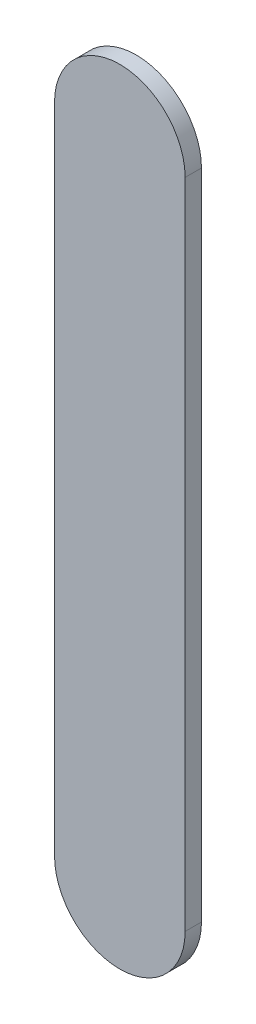
ISO-10303-21;
HEADER;
FILE_DESCRIPTION(('STEP AP214'),'2;1');
FILE_NAME('part.step','',(''),(''),'','','');
FILE_SCHEMA(('AUTOMOTIVE_DESIGN { 1 0 10303 214 1 1 1 1 }'));
ENDSEC;
DATA;
#1=APPLICATION_CONTEXT('core data for automotive mechanical design processes');
#2=APPLICATION_PROTOCOL_DEFINITION('international standard','automotive_design',2000,#1);
#3=PRODUCT_CONTEXT('',#1,'mechanical');
#4=PRODUCT('Part','Part','',(#3));
#5=PRODUCT_RELATED_PRODUCT_CATEGORY('part','',(#4));
#6=PRODUCT_DEFINITION_FORMATION('','',#4);
#7=PRODUCT_DEFINITION_CONTEXT('part definition',#1,'design');
#8=PRODUCT_DEFINITION('design','',#6,#7);
#9=PRODUCT_DEFINITION_SHAPE('','',#8);
#10=(LENGTH_UNIT() NAMED_UNIT(*) SI_UNIT(.MILLI.,.METRE.));
#11=(NAMED_UNIT(*) PLANE_ANGLE_UNIT() SI_UNIT($,.RADIAN.));
#12=(NAMED_UNIT(*) SI_UNIT($,.STERADIAN.) SOLID_ANGLE_UNIT());
#13=UNCERTAINTY_MEASURE_WITH_UNIT(LENGTH_MEASURE(1.E-05),#10,'distance_accuracy_value','');
#14=(GEOMETRIC_REPRESENTATION_CONTEXT(3) GLOBAL_UNCERTAINTY_ASSIGNED_CONTEXT((#13)) GLOBAL_UNIT_ASSIGNED_CONTEXT((#10,
#11,#12)) REPRESENTATION_CONTEXT('',''));
#15=CARTESIAN_POINT('',(0.,0.,0.));
#16=DIRECTION('',(0.,0.,1.));
#17=DIRECTION('',(1.,0.,0.));
#18=AXIS2_PLACEMENT_3D('',#15,#16,#17);
#19=CARTESIAN_POINT('',(4.,0.,1.));
#20=DIRECTION('',(0.,0.,-1.));
#21=DIRECTION('',(-1.,0.,0.));
#22=AXIS2_PLACEMENT_3D('',#19,#20,#21);
#23=CYLINDRICAL_SURFACE('',#22,4.);
#24=CARTESIAN_POINT('',(4.,0.,0.));
#25=DIRECTION('',(0.,0.,1.));
#26=DIRECTION('',(1.,0.,0.));
#27=AXIS2_PLACEMENT_3D('',#24,#25,#26);
#28=CIRCLE('',#27,4.);
#29=CARTESIAN_POINT('',(0.,0.,0.));
#30=VERTEX_POINT('',#29);
#31=CARTESIAN_POINT('',(8.,0.,0.));
#32=VERTEX_POINT('',#31);
#33=EDGE_CURVE('E105',#30,#32,#28,.T.);
#34=ORIENTED_EDGE('',*,*,#33,.T.);
#35=DIRECTION('',(0.,0.,-1.));
#36=VECTOR('',#35,1.);
#37=CARTESIAN_POINT('',(8.,0.,1.));
#38=LINE('',#37,#36);
#39=CARTESIAN_POINT('',(8.,0.,1.));
#40=VERTEX_POINT('',#39);
#41=EDGE_CURVE('E11',#40,#32,#38,.T.);
#42=ORIENTED_EDGE('',*,*,#41,.F.);
#43=CARTESIAN_POINT('',(4.,0.,1.));
#44=DIRECTION('',(0.,0.,1.));
#45=DIRECTION('',(1.,0.,0.));
#46=AXIS2_PLACEMENT_3D('',#43,#44,#45);
#47=CIRCLE('',#46,4.);
#48=CARTESIAN_POINT('',(0.,0.,1.));
#49=VERTEX_POINT('',#48);
#50=EDGE_CURVE('E89',#49,#40,#47,.T.);
#51=ORIENTED_EDGE('',*,*,#50,.F.);
#52=DIRECTION('',(0.,0.,-1.));
#53=VECTOR('',#52,1.);
#54=CARTESIAN_POINT('',(0.,0.,1.));
#55=LINE('',#54,#53);
#56=EDGE_CURVE('E97',#49,#30,#55,.T.);
#57=ORIENTED_EDGE('',*,*,#56,.T.);
#58=EDGE_LOOP('',(#34,#42,#51,#57));
#59=FACE_BOUND('',#58,.T.);
#60=ADVANCED_FACE('F39',(#59),#23,.T.);
#61=CARTESIAN_POINT('',(8.,0.,1.));
#62=DIRECTION('',(-1.,0.,0.));
#63=DIRECTION('',(0.,-1.,0.));
#64=AXIS2_PLACEMENT_3D('',#61,#62,#63);
#65=PLANE('',#64);
#66=DIRECTION('',(0.,1.,0.));
#67=VECTOR('',#66,1.);
#68=CARTESIAN_POINT('',(8.,0.,0.));
#69=LINE('',#68,#67);
#70=CARTESIAN_POINT('',(7.99999999999999,40.,0.));
#71=VERTEX_POINT('',#70);
#72=EDGE_CURVE('E92',#32,#71,#69,.T.);
#73=ORIENTED_EDGE('',*,*,#72,.T.);
#74=DIRECTION('',(0.,0.,-1.));
#75=VECTOR('',#74,1.);
#76=CARTESIAN_POINT('',(7.99999999999999,40.,1.));
#77=LINE('',#76,#75);
#78=CARTESIAN_POINT('',(7.99999999999999,40.,1.));
#79=VERTEX_POINT('',#78);
#80=EDGE_CURVE('E50',#79,#71,#77,.T.);
#81=ORIENTED_EDGE('',*,*,#80,.F.);
#82=DIRECTION('',(0.,1.,0.));
#83=VECTOR('',#82,1.);
#84=CARTESIAN_POINT('',(8.,0.,1.));
#85=LINE('',#84,#83);
#86=EDGE_CURVE('E82',#40,#79,#85,.T.);
#87=ORIENTED_EDGE('',*,*,#86,.F.);
#88=ORIENTED_EDGE('',*,*,#41,.T.);
#89=EDGE_LOOP('',(#73,#81,#87,#88));
#90=FACE_BOUND('',#89,.T.);
#91=ADVANCED_FACE('F93',(#90),#65,.F.);
#92=CARTESIAN_POINT('',(3.99999999999999,40.,1.));
#93=DIRECTION('',(0.,0.,-1.));
#94=DIRECTION('',(-1.,0.,0.));
#95=AXIS2_PLACEMENT_3D('',#92,#93,#94);
#96=CYLINDRICAL_SURFACE('',#95,4.);
#97=CARTESIAN_POINT('',(3.99999999999999,40.,0.));
#98=DIRECTION('',(0.,0.,1.));
#99=DIRECTION('',(1.,0.,0.));
#100=AXIS2_PLACEMENT_3D('',#97,#98,#99);
#101=CIRCLE('',#100,4.);
#102=CARTESIAN_POINT('',(0.,40.,0.));
#103=VERTEX_POINT('',#102);
#104=EDGE_CURVE('E72',#71,#103,#101,.T.);
#105=ORIENTED_EDGE('',*,*,#104,.T.);
#106=DIRECTION('',(0.,0.,-1.));
#107=VECTOR('',#106,1.);
#108=CARTESIAN_POINT('',(0.,40.,1.));
#109=LINE('',#108,#107);
#110=CARTESIAN_POINT('',(0.,40.,1.));
#111=VERTEX_POINT('',#110);
#112=EDGE_CURVE('E94',#111,#103,#109,.T.);
#113=ORIENTED_EDGE('',*,*,#112,.F.);
#114=CARTESIAN_POINT('',(3.99999999999999,40.,1.));
#115=DIRECTION('',(0.,0.,1.));
#116=DIRECTION('',(1.,0.,0.));
#117=AXIS2_PLACEMENT_3D('',#114,#115,#116);
#118=CIRCLE('',#117,4.);
#119=EDGE_CURVE('E88',#79,#111,#118,.T.);
#120=ORIENTED_EDGE('',*,*,#119,.F.);
#121=ORIENTED_EDGE('',*,*,#80,.T.);
#122=EDGE_LOOP('',(#105,#113,#120,#121));
#123=FACE_BOUND('',#122,.T.);
#124=ADVANCED_FACE('F96',(#123),#96,.T.);
#125=CARTESIAN_POINT('',(0.,0.,1.));
#126=DIRECTION('',(1.,0.,0.));
#127=DIRECTION('',(0.,1.,0.));
#128=AXIS2_PLACEMENT_3D('',#125,#126,#127);
#129=PLANE('',#128);
#130=DIRECTION('',(0.,-1.,0.));
#131=VECTOR('',#130,1.);
#132=CARTESIAN_POINT('',(0.,0.,0.));
#133=LINE('',#132,#131);
#134=EDGE_CURVE('E76',#103,#30,#133,.T.);
#135=ORIENTED_EDGE('',*,*,#134,.T.);
#136=ORIENTED_EDGE('',*,*,#56,.F.);
#137=DIRECTION('',(0.,-1.,0.));
#138=VECTOR('',#137,1.);
#139=CARTESIAN_POINT('',(0.,0.,1.));
#140=LINE('',#139,#138);
#141=EDGE_CURVE('E54',#111,#49,#140,.T.);
#142=ORIENTED_EDGE('',*,*,#141,.F.);
#143=ORIENTED_EDGE('',*,*,#112,.T.);
#144=EDGE_LOOP('',(#135,#136,#142,#143));
#145=FACE_BOUND('',#144,.T.);
#146=ADVANCED_FACE('F108',(#145),#129,.F.);
#147=CARTESIAN_POINT('',(4.,0.,1.));
#148=DIRECTION('',(0.,0.,1.));
#149=DIRECTION('',(1.,0.,0.));
#150=AXIS2_PLACEMENT_3D('',#147,#148,#149);
#151=PLANE('',#150);
#152=ORIENTED_EDGE('',*,*,#50,.T.);
#153=ORIENTED_EDGE('',*,*,#86,.T.);
#154=ORIENTED_EDGE('',*,*,#119,.T.);
#155=ORIENTED_EDGE('',*,*,#141,.T.);
#156=EDGE_LOOP('',(#152,#153,#154,#155));
#157=FACE_BOUND('',#156,.T.);
#158=ADVANCED_FACE('F86',(#157),#151,.T.);
#159=CARTESIAN_POINT('',(4.,0.,0.));
#160=DIRECTION('',(0.,0.,1.));
#161=DIRECTION('',(1.,0.,0.));
#162=AXIS2_PLACEMENT_3D('',#159,#160,#161);
#163=PLANE('',#162);
#164=ORIENTED_EDGE('',*,*,#33,.F.);
#165=ORIENTED_EDGE('',*,*,#134,.F.);
#166=ORIENTED_EDGE('',*,*,#104,.F.);
#167=ORIENTED_EDGE('',*,*,#72,.F.);
#168=EDGE_LOOP('',(#164,#165,#166,#167));
#169=FACE_BOUND('',#168,.T.);
#170=ADVANCED_FACE('F115',(#169),#163,.F.);
#171=CLOSED_SHELL('',(#60,#91,#124,#146,#158,#170));
#172=MANIFOLD_SOLID_BREP('B2',#171);
#173=ADVANCED_BREP_SHAPE_REPRESENTATION('',(#18,#172),#14);
#174=SHAPE_DEFINITION_REPRESENTATION(#9,#173);
ENDSEC;
END-ISO-10303-21;
